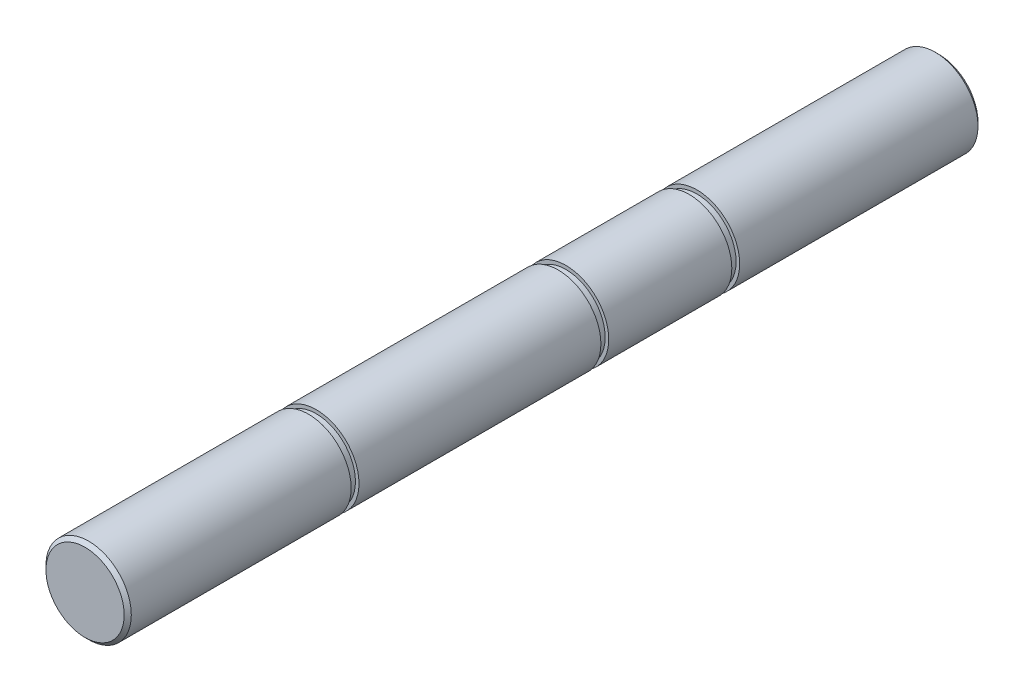
ISO-10303-21;
HEADER;
FILE_DESCRIPTION(('STEP AP214'),'2;1');
FILE_NAME('part.step','',(''),(''),'','','');
FILE_SCHEMA(('AUTOMOTIVE_DESIGN { 1 0 10303 214 1 1 1 1 }'));
ENDSEC;
DATA;
#1=APPLICATION_CONTEXT('core data for automotive mechanical design processes');
#2=APPLICATION_PROTOCOL_DEFINITION('international standard','automotive_design',2000,#1);
#3=PRODUCT_CONTEXT('',#1,'mechanical');
#4=PRODUCT('Part','Part','',(#3));
#5=PRODUCT_RELATED_PRODUCT_CATEGORY('part','',(#4));
#6=PRODUCT_DEFINITION_FORMATION('','',#4);
#7=PRODUCT_DEFINITION_CONTEXT('part definition',#1,'design');
#8=PRODUCT_DEFINITION('design','',#6,#7);
#9=PRODUCT_DEFINITION_SHAPE('','',#8);
#10=(LENGTH_UNIT() NAMED_UNIT(*) SI_UNIT(.MILLI.,.METRE.));
#11=(NAMED_UNIT(*) PLANE_ANGLE_UNIT() SI_UNIT($,.RADIAN.));
#12=(NAMED_UNIT(*) SI_UNIT($,.STERADIAN.) SOLID_ANGLE_UNIT());
#13=UNCERTAINTY_MEASURE_WITH_UNIT(LENGTH_MEASURE(1.E-05),#10,'distance_accuracy_value','');
#14=(GEOMETRIC_REPRESENTATION_CONTEXT(3) GLOBAL_UNCERTAINTY_ASSIGNED_CONTEXT((#13)) GLOBAL_UNIT_ASSIGNED_CONTEXT((#10,
#11,#12)) REPRESENTATION_CONTEXT('',''));
#15=CARTESIAN_POINT('',(0.,0.,0.));
#16=DIRECTION('',(0.,0.,1.));
#17=DIRECTION('',(1.,0.,0.));
#18=AXIS2_PLACEMENT_3D('',#15,#16,#17);
#19=CARTESIAN_POINT('',(0.,0.,120.));
#20=DIRECTION('',(0.,0.,-1.));
#21=DIRECTION('',(-1.,0.,0.));
#22=AXIS2_PLACEMENT_3D('',#19,#20,#21);
#23=CYLINDRICAL_SURFACE('',#22,6.);
#24=DIRECTION('',(0.,0.,-1.));
#25=VECTOR('',#24,1.);
#26=CARTESIAN_POINT('',(2.00000000000002,-5.65685424949238,120.));
#27=LINE('',#26,#25);
#28=CARTESIAN_POINT('',(2.00000000000001,-5.65685424949238,84.));
#29=VERTEX_POINT('',#28);
#30=CARTESIAN_POINT('',(2.00000000000001,-5.65685424949238,58.));
#31=VERTEX_POINT('',#30);
#32=EDGE_CURVE('E120',#29,#31,#27,.T.);
#33=ORIENTED_EDGE('',*,*,#32,.T.);
#34=CARTESIAN_POINT('',(2.00000000000001,-5.65685424949238,58.));
#35=CARTESIAN_POINT('',(2.0000014949184,-5.65684884188678,57.9454190063978));
#36=CARTESIAN_POINT('',(1.99776424917479,-5.6576451988649,57.8908658756213));
#37=CARTESIAN_POINT('',(1.98885121407281,-5.66078654578441,57.7821828318902));
#38=CARTESIAN_POINT('',(1.98217662286706,-5.66313111768244,57.7280528086806));
#39=CARTESIAN_POINT('',(1.95562135046158,-5.67238184449301,57.5672157136097));
#40=CARTESIAN_POINT('',(1.92920846605623,-5.6815058499903,57.461638307459));
#41=CARTESIAN_POINT('',(1.85991682366086,-5.70456149397718,57.2567496151124));
#42=CARTESIAN_POINT('',(1.81704715197507,-5.71849047905858,57.1574349062541));
#43=CARTESIAN_POINT('',(1.71614645792975,-5.74957574438921,56.9673203319891));
#44=CARTESIAN_POINT('',(1.65810612564548,-5.76673400456216,56.8765257418653));
#45=CARTESIAN_POINT('',(1.52610278704603,-5.80308960804095,56.7025595373509));
#46=CARTESIAN_POINT('',(1.45164996064408,-5.82233755536618,56.6197702390748));
#47=CARTESIAN_POINT('',(1.28997688598297,-5.86027697385956,56.4675879644166));
#48=CARTESIAN_POINT('',(1.20275436910908,-5.87896834543706,56.3981973734881));
#49=CARTESIAN_POINT('',(1.01520729191253,-5.91427765988454,56.2730409623916));
#50=CARTESIAN_POINT('',(0.914600178716997,-5.93082875123708,56.2176780311955));
#51=CARTESIAN_POINT('',(0.704858499931721,-5.95939217209317,56.1248154966255));
#52=CARTESIAN_POINT('',(0.595726551186842,-5.97140588786619,56.0873104363591));
#53=CARTESIAN_POINT('',(0.376058690956076,-5.98918142285845,56.0325285478173));
#54=CARTESIAN_POINT('',(0.265703668920227,-5.99514617977147,56.0145934548926));
#55=CARTESIAN_POINT('',(0.0433979389113495,-6.00087216807634,55.9973674029488));
#56=CARTESIAN_POINT('',(-0.068552382490781,-6.00063487762605,55.9980720014605));
#57=CARTESIAN_POINT('',(-0.28620769055878,-5.99412077270532,56.0176885662133));
#58=CARTESIAN_POINT('',(-0.391985405251068,-5.98808121982527,56.0358852759189));
#59=CARTESIAN_POINT('',(-0.598888128753307,-5.97093921001647,56.0887863973482));
#60=CARTESIAN_POINT('',(-0.700012879232923,-5.95983647235462,56.1234917244125));
#61=CARTESIAN_POINT('',(-0.89630524606192,-5.93351336542609,56.2088427392013));
#62=CARTESIAN_POINT('',(-0.991377011307981,-5.91824075676625,56.2596920902447));
#63=CARTESIAN_POINT('',(-1.17184917819497,-5.88516775360088,56.3757199027814));
#64=CARTESIAN_POINT('',(-1.25724693942936,-5.86736667195187,56.440902262093));
#65=CARTESIAN_POINT('',(-1.42019467942242,-5.83012543885479,56.5873420999937));
#66=CARTESIAN_POINT('',(-1.49718722322539,-5.81064757359828,56.6692110872194));
#67=CARTESIAN_POINT('',(-1.63654404964076,-5.77294980945703,56.8448829794323));
#68=CARTESIAN_POINT('',(-1.69890360636762,-5.75473031831507,56.9386897248065));
#69=CARTESIAN_POINT('',(-1.80800665118556,-5.72140062752635,57.1373603567066));
#70=CARTESIAN_POINT('',(-1.85450601901536,-5.70634029896469,57.2423670298659));
#71=CARTESIAN_POINT('',(-1.92892046140223,-5.68162194124078,57.4592939551799));
#72=CARTESIAN_POINT('',(-1.95686487211071,-5.67195538817986,57.5712029867443));
#73=CARTESIAN_POINT('',(-1.98331631256165,-5.6627308418944,57.736837273496));
#74=CARTESIAN_POINT('',(-1.98957012251022,-5.66053335389204,57.7892827797085));
#75=CARTESIAN_POINT('',(-1.99790923214239,-5.65759407142798,57.8944761567996));
#76=CARTESIAN_POINT('',(-1.99999991078995,-5.65685039859056,57.9472235490888));
#77=CARTESIAN_POINT('',(-1.99999999999999,-5.65685424949238,58.));
#78=B_SPLINE_CURVE_WITH_KNOTS('',3,(#34,#35,#36,#37,#38,#39,#40,#41,#42,#43,#44,#45,#46,#47,#48,
#49,#50,#51,#52,#53,#54,#55,#56,#57,#58,#59,#60,#61,#62,#63,#64,#65,#66,#67,#68,#69,#70,#71,#72,
#73,#74,#75,#76,#77),.UNSPECIFIED.,.F.,.F.,(4,2,2,2,2,2,2,2,2,2,2,2,2,2,2,2,2,2,2,2,2,4),(0.,
0.163636969470867,0.327229772338926,0.653162396790749,0.978915321932481,1.30486862627062,
1.64233009925356,1.97985159727495,2.32618265866203,2.67240782242255,3.00658941454806,
3.34069136061285,3.66168836931471,3.98270317816496,4.30794037651936,4.63326613177538,
4.97388108116101,5.31460588498485,5.66036059856081,6.00556734973679,6.16399790665502,
6.32222363058113),.UNSPECIFIED.);
#79=CARTESIAN_POINT('',(-1.99999999999999,-5.65685424949239,58.));
#80=VERTEX_POINT('',#79);
#81=EDGE_CURVE('E60',#31,#80,#78,.T.);
#82=ORIENTED_EDGE('',*,*,#81,.T.);
#83=DIRECTION('',(0.,0.,-1.));
#84=VECTOR('',#83,1.);
#85=CARTESIAN_POINT('',(-1.99999999999998,-5.65685424949239,120.));
#86=LINE('',#85,#84);
#87=CARTESIAN_POINT('',(-1.99999999999998,-5.65685424949239,84.));
#88=VERTEX_POINT('',#87);
#89=EDGE_CURVE('E81',#80,#88,#86,.F.);
#90=ORIENTED_EDGE('',*,*,#89,.T.);
#91=CARTESIAN_POINT('',(-1.99999999999999,-5.65685424949239,84.));
#92=CARTESIAN_POINT('',(-2.00000149491838,-5.65684884188678,84.0545809936022));
#93=CARTESIAN_POINT('',(-1.99776424917477,-5.65764519886491,84.1091341243786));
#94=CARTESIAN_POINT('',(-1.98885121407279,-5.66078654578442,84.2178171681098));
#95=CARTESIAN_POINT('',(-1.98217662286704,-5.66313111768244,84.2719471913194));
#96=CARTESIAN_POINT('',(-1.95562135046156,-5.67238184449302,84.4327842863903));
#97=CARTESIAN_POINT('',(-1.92920846605622,-5.68150584999031,84.5383616925409));
#98=CARTESIAN_POINT('',(-1.85991682366084,-5.70456149397718,84.7432503848875));
#99=CARTESIAN_POINT('',(-1.81704715197506,-5.71849047905859,84.8425650937458));
#100=CARTESIAN_POINT('',(-1.71614645792973,-5.74957574438922,85.0326796680109));
#101=CARTESIAN_POINT('',(-1.65810612564546,-5.76673400456217,85.1234742581347));
#102=CARTESIAN_POINT('',(-1.52610278704601,-5.80308960804095,85.2974404626491));
#103=CARTESIAN_POINT('',(-1.45164996064406,-5.82233755536618,85.3802297609252));
#104=CARTESIAN_POINT('',(-1.28997688598295,-5.86027697385956,85.5324120355834));
#105=CARTESIAN_POINT('',(-1.20275436910906,-5.87896834543706,85.6018026265119));
#106=CARTESIAN_POINT('',(-1.01520729191251,-5.91427765988455,85.7269590376084));
#107=CARTESIAN_POINT('',(-0.914600178716981,-5.93082875123708,85.7823219688045));
#108=CARTESIAN_POINT('',(-0.704858499931707,-5.95939217209317,85.8751845033745));
#109=CARTESIAN_POINT('',(-0.595726551186827,-5.97140588786619,85.9126895636409));
#110=CARTESIAN_POINT('',(-0.376058690956061,-5.98918142285845,85.9674714521827));
#111=CARTESIAN_POINT('',(-0.265703668920213,-5.99514617977147,85.9854065451074));
#112=CARTESIAN_POINT('',(-0.0433979389113379,-6.00087216807634,86.0026325970512));
#113=CARTESIAN_POINT('',(0.0685523824907923,-6.00063487762605,86.0019279985395));
#114=CARTESIAN_POINT('',(0.286207690558791,-5.99412077270532,85.9823114337867));
#115=CARTESIAN_POINT('',(0.391985405251078,-5.98808121982527,85.9641147240811));
#116=CARTESIAN_POINT('',(0.598888128753318,-5.97093921001647,85.9112136026518));
#117=CARTESIAN_POINT('',(0.700012879232935,-5.95983647235462,85.8765082755875));
#118=CARTESIAN_POINT('',(0.896305246061931,-5.93351336542608,85.7911572607987));
#119=CARTESIAN_POINT('',(0.991377011307989,-5.91824075676625,85.7403079097553));
#120=CARTESIAN_POINT('',(1.17184917819498,-5.88516775360088,85.6242800972186));
#121=CARTESIAN_POINT('',(1.25724693942938,-5.86736667195186,85.559097737907));
#122=CARTESIAN_POINT('',(1.42019467942243,-5.83012543885479,85.4126579000063));
#123=CARTESIAN_POINT('',(1.49718722322541,-5.81064757359828,85.3307889127806));
#124=CARTESIAN_POINT('',(1.63654404964078,-5.77294980945702,85.1551170205677));
#125=CARTESIAN_POINT('',(1.69890360636763,-5.75473031831506,85.0613102751935));
#126=CARTESIAN_POINT('',(1.80800665118558,-5.72140062752635,84.8626396432934));
#127=CARTESIAN_POINT('',(1.85450601901537,-5.70634029896469,84.7576329701341));
#128=CARTESIAN_POINT('',(1.92892046140224,-5.68162194124078,84.5407060448201));
#129=CARTESIAN_POINT('',(1.95686487211072,-5.67195538817985,84.4287970132557));
#130=CARTESIAN_POINT('',(1.98331631256167,-5.6627308418944,84.263162726504));
#131=CARTESIAN_POINT('',(1.98957012251024,-5.66053335389203,84.2107172202915));
#132=CARTESIAN_POINT('',(1.99790923214241,-5.65759407142798,84.1055238432004));
#133=CARTESIAN_POINT('',(1.99999991078997,-5.65685039859056,84.0527764509112));
#134=CARTESIAN_POINT('',(2.00000000000001,-5.65685424949238,84.));
#135=B_SPLINE_CURVE_WITH_KNOTS('',3,(#91,#92,#93,#94,#95,#96,#97,#98,#99,#100,#101,#102,#103,
#104,#105,#106,#107,#108,#109,#110,#111,#112,#113,#114,#115,#116,#117,#118,#119,#120,#121,#122,
#123,#124,#125,#126,#127,#128,#129,#130,#131,#132,#133,#134),.UNSPECIFIED.,.F.,.F.,(4,2,2,2,2,2,
2,2,2,2,2,2,2,2,2,2,2,2,2,2,2,4),(0.,0.163636969470867,0.327229772338933,0.653162396790742,
0.978915321932481,1.30486862627062,1.64233009925356,1.97985159727495,2.32618265866203,
2.67240782242254,3.00658941454805,3.34069136061284,3.66168836931469,3.98270317816495,
4.30794037651935,4.63326613177537,4.973881081161,5.31460588498485,5.6603605985608,
6.00556734973678,6.16399790665503,6.32222363058113),.UNSPECIFIED.);
#136=EDGE_CURVE('E111',#88,#29,#135,.T.);
#137=ORIENTED_EDGE('',*,*,#136,.T.);
#138=EDGE_LOOP('',(#33,#82,#90,#137));
#139=FACE_BOUND('',#138,.T.);
#140=CARTESIAN_POINT('',(0.,0.,87.5));
#141=DIRECTION('',(0.,0.,1.));
#142=DIRECTION('',(1.,0.,0.));
#143=AXIS2_PLACEMENT_3D('',#140,#141,#142);
#144=CIRCLE('',#143,6.);
#145=CARTESIAN_POINT('',(6.,0.,87.5));
#146=VERTEX_POINT('',#145);
#147=EDGE_CURVE('E97',#146,#146,#144,.T.);
#148=ORIENTED_EDGE('',*,*,#147,.F.);
#149=EDGE_LOOP('',(#148));
#150=FACE_BOUND('',#149,.T.);
#151=CARTESIAN_POINT('',(0.,0.,53.5));
#152=DIRECTION('',(0.,0.,1.));
#153=DIRECTION('',(1.,0.,0.));
#154=AXIS2_PLACEMENT_3D('',#151,#152,#153);
#155=CIRCLE('',#154,6.);
#156=CARTESIAN_POINT('',(6.,0.,53.5));
#157=VERTEX_POINT('',#156);
#158=EDGE_CURVE('E382',#157,#157,#155,.T.);
#159=ORIENTED_EDGE('',*,*,#158,.T.);
#160=EDGE_LOOP('',(#159));
#161=FACE_BOUND('',#160,.T.);
#162=ADVANCED_FACE('F37',(#139,#150,#161),#23,.T.);
#163=CARTESIAN_POINT('',(0.,-13.5,58.));
#164=DIRECTION('',(0.,1.,0.));
#165=DIRECTION('',(0.,0.,1.));
#166=AXIS2_PLACEMENT_3D('',#163,#164,#165);
#167=CYLINDRICAL_SURFACE('',#166,2.);
#168=DIRECTION('',(0.,1.,0.));
#169=VECTOR('',#168,1.);
#170=CARTESIAN_POINT('',(2.00000000000001,-13.5,58.));
#171=LINE('',#170,#169);
#172=CARTESIAN_POINT('',(2.00000000000001,-3.5,58.));
#173=VERTEX_POINT('',#172);
#174=EDGE_CURVE('E96',#31,#173,#171,.T.);
#175=ORIENTED_EDGE('',*,*,#174,.T.);
#176=CARTESIAN_POINT('',(0.,-3.5,58.));
#177=DIRECTION('',(0.,1.,0.));
#178=DIRECTION('',(0.,0.,1.));
#179=AXIS2_PLACEMENT_3D('',#176,#177,#178);
#180=CIRCLE('',#179,2.);
#181=CARTESIAN_POINT('',(-1.99999999999999,-3.5,58.));
#182=VERTEX_POINT('',#181);
#183=EDGE_CURVE('E90',#173,#182,#180,.T.);
#184=ORIENTED_EDGE('',*,*,#183,.T.);
#185=DIRECTION('',(0.,1.,0.));
#186=VECTOR('',#185,1.);
#187=CARTESIAN_POINT('',(-1.99999999999999,-13.5,58.));
#188=LINE('',#187,#186);
#189=EDGE_CURVE('E76',#80,#182,#188,.T.);
#190=ORIENTED_EDGE('',*,*,#189,.F.);
#191=ORIENTED_EDGE('',*,*,#81,.F.);
#192=EDGE_LOOP('',(#175,#184,#190,#191));
#193=FACE_BOUND('',#192,.T.);
#194=ADVANCED_FACE('F95',(#193),#167,.F.);
#195=CARTESIAN_POINT('',(2.00000000000001,-13.5,58.));
#196=DIRECTION('',(1.,0.,0.));
#197=DIRECTION('',(0.,0.,-1.));
#198=AXIS2_PLACEMENT_3D('',#195,#196,#197);
#199=PLANE('',#198);
#200=DIRECTION('',(0.,1.,0.));
#201=VECTOR('',#200,1.);
#202=CARTESIAN_POINT('',(2.00000000000001,-13.5,84.));
#203=LINE('',#202,#201);
#204=CARTESIAN_POINT('',(2.00000000000001,-3.5,84.));
#205=VERTEX_POINT('',#204);
#206=EDGE_CURVE('E107',#29,#205,#203,.T.);
#207=ORIENTED_EDGE('',*,*,#206,.T.);
#208=DIRECTION('',(0.,0.,-1.));
#209=VECTOR('',#208,1.);
#210=CARTESIAN_POINT('',(2.00000000000001,-3.5,58.));
#211=LINE('',#210,#209);
#212=EDGE_CURVE('E83',#205,#173,#211,.T.);
#213=ORIENTED_EDGE('',*,*,#212,.T.);
#214=ORIENTED_EDGE('',*,*,#174,.F.);
#215=ORIENTED_EDGE('',*,*,#32,.F.);
#216=EDGE_LOOP('',(#207,#213,#214,#215));
#217=FACE_BOUND('',#216,.T.);
#218=ADVANCED_FACE('F129',(#217),#199,.F.);
#219=CARTESIAN_POINT('',(0.,-13.5,84.));
#220=DIRECTION('',(0.,1.,0.));
#221=DIRECTION('',(0.,0.,1.));
#222=AXIS2_PLACEMENT_3D('',#219,#220,#221);
#223=CYLINDRICAL_SURFACE('',#222,2.);
#224=DIRECTION('',(0.,1.,0.));
#225=VECTOR('',#224,1.);
#226=CARTESIAN_POINT('',(-1.99999999999999,-13.5,84.));
#227=LINE('',#226,#225);
#228=CARTESIAN_POINT('',(-1.99999999999999,-3.5,84.));
#229=VERTEX_POINT('',#228);
#230=EDGE_CURVE('E52',#88,#229,#227,.T.);
#231=ORIENTED_EDGE('',*,*,#230,.T.);
#232=CARTESIAN_POINT('',(0.,-3.5,84.));
#233=DIRECTION('',(0.,1.,0.));
#234=DIRECTION('',(0.,0.,1.));
#235=AXIS2_PLACEMENT_3D('',#232,#233,#234);
#236=CIRCLE('',#235,2.);
#237=EDGE_CURVE('E93',#229,#205,#236,.T.);
#238=ORIENTED_EDGE('',*,*,#237,.T.);
#239=ORIENTED_EDGE('',*,*,#206,.F.);
#240=ORIENTED_EDGE('',*,*,#136,.F.);
#241=EDGE_LOOP('',(#231,#238,#239,#240));
#242=FACE_BOUND('',#241,.T.);
#243=ADVANCED_FACE('F124',(#242),#223,.F.);
#244=CARTESIAN_POINT('',(-1.99999999999999,-13.5,58.));
#245=DIRECTION('',(-1.,0.,0.));
#246=DIRECTION('',(0.,0.,1.));
#247=AXIS2_PLACEMENT_3D('',#244,#245,#246);
#248=PLANE('',#247);
#249=ORIENTED_EDGE('',*,*,#189,.T.);
#250=DIRECTION('',(0.,0.,1.));
#251=VECTOR('',#250,1.);
#252=CARTESIAN_POINT('',(-1.99999999999999,-3.5,58.));
#253=LINE('',#252,#251);
#254=EDGE_CURVE('E79',#182,#229,#253,.T.);
#255=ORIENTED_EDGE('',*,*,#254,.T.);
#256=ORIENTED_EDGE('',*,*,#230,.F.);
#257=ORIENTED_EDGE('',*,*,#89,.F.);
#258=EDGE_LOOP('',(#249,#255,#256,#257));
#259=FACE_BOUND('',#258,.T.);
#260=ADVANCED_FACE('F78',(#259),#248,.F.);
#261=CARTESIAN_POINT('',(0.,-3.5,58.));
#262=DIRECTION('',(0.,1.,0.));
#263=DIRECTION('',(0.,0.,1.));
#264=AXIS2_PLACEMENT_3D('',#261,#262,#263);
#265=PLANE('',#264);
#266=ORIENTED_EDGE('',*,*,#183,.F.);
#267=ORIENTED_EDGE('',*,*,#212,.F.);
#268=ORIENTED_EDGE('',*,*,#237,.F.);
#269=ORIENTED_EDGE('',*,*,#254,.F.);
#270=EDGE_LOOP('',(#266,#267,#268,#269));
#271=FACE_BOUND('',#270,.T.);
#272=ADVANCED_FACE('F88',(#271),#265,.F.);
#273=CARTESIAN_POINT('',(0.,5.5,87.5));
#274=DIRECTION('',(0.,0.,1.));
#275=DIRECTION('',(1.,0.,0.));
#276=AXIS2_PLACEMENT_3D('',#273,#274,#275);
#277=PLANE('',#276);
#278=ORIENTED_EDGE('',*,*,#147,.T.);
#279=EDGE_LOOP('',(#278));
#280=FACE_BOUND('',#279,.T.);
#281=CARTESIAN_POINT('',(0.,0.,87.5));
#282=DIRECTION('',(0.,0.,1.));
#283=DIRECTION('',(1.,0.,0.));
#284=AXIS2_PLACEMENT_3D('',#281,#282,#283);
#285=CIRCLE('',#284,5.5);
#286=CARTESIAN_POINT('',(5.5,0.,87.5));
#287=VERTEX_POINT('',#286);
#288=EDGE_CURVE('E215',#287,#287,#285,.T.);
#289=ORIENTED_EDGE('',*,*,#288,.F.);
#290=EDGE_LOOP('',(#289));
#291=FACE_BOUND('',#290,.T.);
#292=ADVANCED_FACE('F225',(#280,#291),#277,.T.);
#293=CARTESIAN_POINT('',(0.,6.,88.6));
#294=DIRECTION('',(0.,0.,-1.));
#295=DIRECTION('',(-1.,0.,0.));
#296=AXIS2_PLACEMENT_3D('',#293,#294,#295);
#297=PLANE('',#296);
#298=CARTESIAN_POINT('',(0.,0.,88.6));
#299=DIRECTION('',(0.,0.,1.));
#300=DIRECTION('',(1.,0.,0.));
#301=AXIS2_PLACEMENT_3D('',#298,#299,#300);
#302=CIRCLE('',#301,5.5);
#303=CARTESIAN_POINT('',(5.5,0.,88.6));
#304=VERTEX_POINT('',#303);
#305=EDGE_CURVE('E218',#304,#304,#302,.T.);
#306=ORIENTED_EDGE('',*,*,#305,.T.);
#307=EDGE_LOOP('',(#306));
#308=FACE_BOUND('',#307,.T.);
#309=CARTESIAN_POINT('',(0.,0.,88.6));
#310=DIRECTION('',(0.,0.,1.));
#311=DIRECTION('',(1.,0.,0.));
#312=AXIS2_PLACEMENT_3D('',#309,#310,#311);
#313=CIRCLE('',#312,6.);
#314=CARTESIAN_POINT('',(6.,0.,88.6));
#315=VERTEX_POINT('',#314);
#316=EDGE_CURVE('E100',#315,#315,#313,.T.);
#317=ORIENTED_EDGE('',*,*,#316,.F.);
#318=EDGE_LOOP('',(#317));
#319=FACE_BOUND('',#318,.T.);
#320=ADVANCED_FACE('F223',(#308,#319),#297,.T.);
#321=CARTESIAN_POINT('',(0.,0.,130.66111505728));
#322=DIRECTION('',(0.,0.,1.));
#323=DIRECTION('',(1.,0.,0.));
#324=AXIS2_PLACEMENT_3D('',#321,#322,#323);
#325=CYLINDRICAL_SURFACE('',#324,5.5);
#326=ORIENTED_EDGE('',*,*,#288,.T.);
#327=EDGE_LOOP('',(#326));
#328=FACE_BOUND('',#327,.T.);
#329=ORIENTED_EDGE('',*,*,#305,.F.);
#330=EDGE_LOOP('',(#329));
#331=FACE_BOUND('',#330,.T.);
#332=ADVANCED_FACE('F182',(#328,#331),#325,.T.);
#333=CARTESIAN_POINT('',(0.,0.,120.));
#334=DIRECTION('',(0.,0.,1.));
#335=DIRECTION('',(1.,0.,0.));
#336=AXIS2_PLACEMENT_3D('',#333,#334,#335);
#337=PLANE('',#336);
#338=CARTESIAN_POINT('',(0.,0.,120.));
#339=DIRECTION('',(0.,0.,1.));
#340=DIRECTION('',(1.,0.,0.));
#341=AXIS2_PLACEMENT_3D('',#338,#339,#340);
#342=CIRCLE('',#341,5.50000000000002);
#343=CARTESIAN_POINT('',(5.50000000000002,0.,120.));
#344=VERTEX_POINT('',#343);
#345=EDGE_CURVE('E45',#344,#344,#342,.T.);
#346=ORIENTED_EDGE('',*,*,#345,.T.);
#347=EDGE_LOOP('',(#346));
#348=FACE_BOUND('',#347,.T.);
#349=ADVANCED_FACE('F137',(#348),#337,.T.);
#350=CARTESIAN_POINT('',(0.,0.,119.5));
#351=DIRECTION('',(0.,0.,1.));
#352=DIRECTION('',(1.,0.,0.));
#353=AXIS2_PLACEMENT_3D('',#350,#351,#352);
#354=CIRCLE('',#353,6.);
#355=CARTESIAN_POINT('',(6.,0.,119.5));
#356=VERTEX_POINT('',#355);
#357=EDGE_CURVE('E11',#356,#356,#354,.F.);
#358=ORIENTED_EDGE('',*,*,#357,.T.);
#359=EDGE_LOOP('',(#358));
#360=FACE_BOUND('',#359,.T.);
#361=ORIENTED_EDGE('',*,*,#316,.T.);
#362=EDGE_LOOP('',(#361));
#363=FACE_BOUND('',#362,.T.);
#364=ADVANCED_FACE('F163',(#360,#363),#23,.T.);
#365=CARTESIAN_POINT('',(0.,6.,53.5));
#366=DIRECTION('',(0.,0.,-1.));
#367=DIRECTION('',(-1.,0.,0.));
#368=AXIS2_PLACEMENT_3D('',#365,#366,#367);
#369=PLANE('',#368);
#370=CARTESIAN_POINT('',(0.,0.,53.5));
#371=DIRECTION('',(0.,0.,1.));
#372=DIRECTION('',(1.,0.,0.));
#373=AXIS2_PLACEMENT_3D('',#370,#371,#372);
#374=CIRCLE('',#373,5.5);
#375=CARTESIAN_POINT('',(5.5,0.,53.5));
#376=VERTEX_POINT('',#375);
#377=EDGE_CURVE('E209',#376,#376,#374,.T.);
#378=ORIENTED_EDGE('',*,*,#377,.T.);
#379=EDGE_LOOP('',(#378));
#380=FACE_BOUND('',#379,.T.);
#381=ORIENTED_EDGE('',*,*,#158,.F.);
#382=EDGE_LOOP('',(#381));
#383=FACE_BOUND('',#382,.T.);
#384=ADVANCED_FACE('F173',(#380,#383),#369,.T.);
#385=CARTESIAN_POINT('',(0.,0.,130.66111505728));
#386=DIRECTION('',(0.,0.,1.));
#387=DIRECTION('',(1.,0.,0.));
#388=AXIS2_PLACEMENT_3D('',#385,#386,#387);
#389=CYLINDRICAL_SURFACE('',#388,5.5);
#390=CARTESIAN_POINT('',(0.,0.,52.4));
#391=DIRECTION('',(0.,0.,1.));
#392=DIRECTION('',(1.,0.,0.));
#393=AXIS2_PLACEMENT_3D('',#390,#391,#392);
#394=CIRCLE('',#393,5.5);
#395=CARTESIAN_POINT('',(5.5,0.,52.4));
#396=VERTEX_POINT('',#395);
#397=EDGE_CURVE('E381',#396,#396,#394,.T.);
#398=ORIENTED_EDGE('',*,*,#397,.T.);
#399=EDGE_LOOP('',(#398));
#400=FACE_BOUND('',#399,.T.);
#401=ORIENTED_EDGE('',*,*,#377,.F.);
#402=EDGE_LOOP('',(#401));
#403=FACE_BOUND('',#402,.T.);
#404=ADVANCED_FACE('F179',(#400,#403),#389,.T.);
#405=CARTESIAN_POINT('',(0.,6.,52.4));
#406=DIRECTION('',(0.,0.,1.));
#407=DIRECTION('',(1.,0.,0.));
#408=AXIS2_PLACEMENT_3D('',#405,#406,#407);
#409=PLANE('',#408);
#410=CARTESIAN_POINT('',(0.,0.,52.4));
#411=DIRECTION('',(0.,0.,1.));
#412=DIRECTION('',(1.,0.,0.));
#413=AXIS2_PLACEMENT_3D('',#410,#411,#412);
#414=CIRCLE('',#413,6.);
#415=CARTESIAN_POINT('',(6.,0.,52.4));
#416=VERTEX_POINT('',#415);
#417=EDGE_CURVE('E380',#416,#416,#414,.T.);
#418=ORIENTED_EDGE('',*,*,#417,.T.);
#419=EDGE_LOOP('',(#418));
#420=FACE_BOUND('',#419,.T.);
#421=ORIENTED_EDGE('',*,*,#397,.F.);
#422=EDGE_LOOP('',(#421));
#423=FACE_BOUND('',#422,.T.);
#424=ADVANCED_FACE('F195',(#420,#423),#409,.T.);
#425=CARTESIAN_POINT('',(0.,0.,0.));
#426=DIRECTION('',(0.,0.,1.));
#427=DIRECTION('',(1.,0.,0.));
#428=AXIS2_PLACEMENT_3D('',#425,#426,#427);
#429=PLANE('',#428);
#430=CARTESIAN_POINT('',(0.,0.,0.));
#431=DIRECTION('',(0.,0.,1.));
#432=DIRECTION('',(1.,0.,0.));
#433=AXIS2_PLACEMENT_3D('',#430,#431,#432);
#434=CIRCLE('',#433,5.49999999999998);
#435=CARTESIAN_POINT('',(5.49999999999998,0.,0.));
#436=VERTEX_POINT('',#435);
#437=EDGE_CURVE('E146',#436,#436,#434,.F.);
#438=ORIENTED_EDGE('',*,*,#437,.T.);
#439=EDGE_LOOP('',(#438));
#440=FACE_BOUND('',#439,.T.);
#441=ADVANCED_FACE('F186',(#440),#429,.F.);
#442=CARTESIAN_POINT('',(0.,0.,0.500000000000014));
#443=DIRECTION('',(0.,0.,1.));
#444=DIRECTION('',(1.,0.,0.));
#445=AXIS2_PLACEMENT_3D('',#442,#443,#444);
#446=CIRCLE('',#445,6.);
#447=CARTESIAN_POINT('',(6.,0.,0.500000000000014));
#448=VERTEX_POINT('',#447);
#449=EDGE_CURVE('E143',#448,#448,#446,.T.);
#450=ORIENTED_EDGE('',*,*,#449,.T.);
#451=EDGE_LOOP('',(#450));
#452=FACE_BOUND('',#451,.T.);
#453=CARTESIAN_POINT('',(0.,0.,34.));
#454=DIRECTION('',(0.,0.,1.));
#455=DIRECTION('',(1.,0.,0.));
#456=AXIS2_PLACEMENT_3D('',#453,#454,#455);
#457=CIRCLE('',#456,6.);
#458=CARTESIAN_POINT('',(6.,0.,34.));
#459=VERTEX_POINT('',#458);
#460=EDGE_CURVE('E201',#459,#459,#457,.T.);
#461=ORIENTED_EDGE('',*,*,#460,.F.);
#462=EDGE_LOOP('',(#461));
#463=FACE_BOUND('',#462,.T.);
#464=ADVANCED_FACE('F171',(#452,#463),#23,.T.);
#465=CARTESIAN_POINT('',(0.,6.,34.));
#466=DIRECTION('',(0.,0.,1.));
#467=DIRECTION('',(1.,0.,0.));
#468=AXIS2_PLACEMENT_3D('',#465,#466,#467);
#469=PLANE('',#468);
#470=ORIENTED_EDGE('',*,*,#460,.T.);
#471=EDGE_LOOP('',(#470));
#472=FACE_BOUND('',#471,.T.);
#473=CARTESIAN_POINT('',(0.,0.,34.));
#474=DIRECTION('',(0.,0.,1.));
#475=DIRECTION('',(1.,0.,0.));
#476=AXIS2_PLACEMENT_3D('',#473,#474,#475);
#477=CIRCLE('',#476,5.5);
#478=CARTESIAN_POINT('',(5.5,0.,34.));
#479=VERTEX_POINT('',#478);
#480=EDGE_CURVE('E202',#479,#479,#477,.T.);
#481=ORIENTED_EDGE('',*,*,#480,.F.);
#482=EDGE_LOOP('',(#481));
#483=FACE_BOUND('',#482,.T.);
#484=ADVANCED_FACE('F185',(#472,#483),#469,.T.);
#485=CARTESIAN_POINT('',(0.,0.,130.66111505728));
#486=DIRECTION('',(0.,0.,1.));
#487=DIRECTION('',(1.,0.,0.));
#488=AXIS2_PLACEMENT_3D('',#485,#486,#487);
#489=CYLINDRICAL_SURFACE('',#488,5.5);
#490=ORIENTED_EDGE('',*,*,#480,.T.);
#491=EDGE_LOOP('',(#490));
#492=FACE_BOUND('',#491,.T.);
#493=CARTESIAN_POINT('',(0.,0.,35.1));
#494=DIRECTION('',(0.,0.,1.));
#495=DIRECTION('',(1.,0.,0.));
#496=AXIS2_PLACEMENT_3D('',#493,#494,#495);
#497=CIRCLE('',#496,5.5);
#498=CARTESIAN_POINT('',(5.5,0.,35.1));
#499=VERTEX_POINT('',#498);
#500=EDGE_CURVE('E206',#499,#499,#497,.T.);
#501=ORIENTED_EDGE('',*,*,#500,.F.);
#502=EDGE_LOOP('',(#501));
#503=FACE_BOUND('',#502,.T.);
#504=ADVANCED_FACE('F192',(#492,#503),#489,.T.);
#505=CARTESIAN_POINT('',(0.,6.,35.1));
#506=DIRECTION('',(0.,0.,-1.));
#507=DIRECTION('',(-1.,0.,0.));
#508=AXIS2_PLACEMENT_3D('',#505,#506,#507);
#509=PLANE('',#508);
#510=ORIENTED_EDGE('',*,*,#500,.T.);
#511=EDGE_LOOP('',(#510));
#512=FACE_BOUND('',#511,.T.);
#513=CARTESIAN_POINT('',(0.,0.,35.1));
#514=DIRECTION('',(0.,0.,1.));
#515=DIRECTION('',(1.,0.,0.));
#516=AXIS2_PLACEMENT_3D('',#513,#514,#515);
#517=CIRCLE('',#516,6.);
#518=CARTESIAN_POINT('',(6.,0.,35.1));
#519=VERTEX_POINT('',#518);
#520=EDGE_CURVE('E203',#519,#519,#517,.T.);
#521=ORIENTED_EDGE('',*,*,#520,.F.);
#522=EDGE_LOOP('',(#521));
#523=FACE_BOUND('',#522,.T.);
#524=ADVANCED_FACE('F169',(#512,#523),#509,.T.);
#525=ORIENTED_EDGE('',*,*,#520,.T.);
#526=EDGE_LOOP('',(#525));
#527=FACE_BOUND('',#526,.T.);
#528=ORIENTED_EDGE('',*,*,#417,.F.);
#529=EDGE_LOOP('',(#528));
#530=FACE_BOUND('',#529,.T.);
#531=ADVANCED_FACE('F158',(#527,#530),#23,.T.);
#532=CARTESIAN_POINT('',(0.,0.,0.500000000000014));
#533=DIRECTION('',(0.,0.,1.));
#534=DIRECTION('',(1.,0.,0.));
#535=AXIS2_PLACEMENT_3D('',#532,#533,#534);
#536=CONICAL_SURFACE('',#535,6.,0.785398163397457);
#537=ORIENTED_EDGE('',*,*,#437,.F.);
#538=EDGE_LOOP('',(#537));
#539=FACE_BOUND('',#538,.T.);
#540=ORIENTED_EDGE('',*,*,#449,.F.);
#541=EDGE_LOOP('',(#540));
#542=FACE_BOUND('',#541,.T.);
#543=ADVANCED_FACE('F153',(#539,#542),#536,.T.);
#544=CARTESIAN_POINT('',(0.,0.,120.));
#545=DIRECTION('',(0.,0.,-1.));
#546=DIRECTION('',(-1.,0.,0.));
#547=AXIS2_PLACEMENT_3D('',#544,#545,#546);
#548=CONICAL_SURFACE('',#547,5.50000000000002,0.785398163397444);
#549=ORIENTED_EDGE('',*,*,#357,.F.);
#550=EDGE_LOOP('',(#549));
#551=FACE_BOUND('',#550,.T.);
#552=ORIENTED_EDGE('',*,*,#345,.F.);
#553=EDGE_LOOP('',(#552));
#554=FACE_BOUND('',#553,.T.);
#555=ADVANCED_FACE('F39',(#551,#554),#548,.T.);
#556=CLOSED_SHELL('',(#162,#194,#218,#243,#260,#272,#292,#320,#332,#349,#364,#384,#404,#424,
#441,#464,#484,#504,#524,#531,#543,#555));
#557=MANIFOLD_SOLID_BREP('B2',#556);
#558=ADVANCED_BREP_SHAPE_REPRESENTATION('',(#18,#557),#14);
#559=SHAPE_DEFINITION_REPRESENTATION(#9,#558);
ENDSEC;
END-ISO-10303-21;
